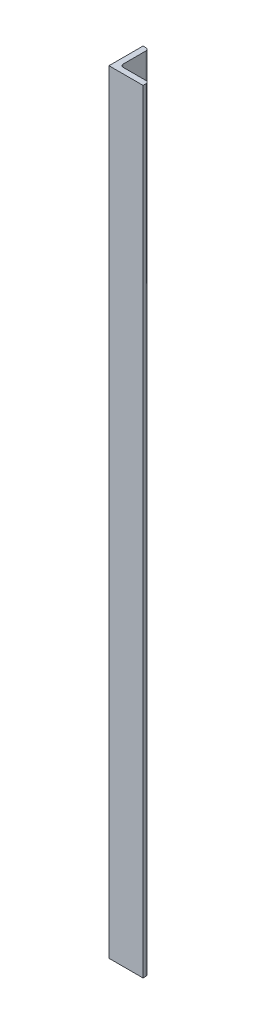
ISO-10303-21;
HEADER;
FILE_DESCRIPTION(('STEP AP214'),'2;1');
FILE_NAME('part.step','',(''),(''),'','','');
FILE_SCHEMA(('AUTOMOTIVE_DESIGN { 1 0 10303 214 1 1 1 1 }'));
ENDSEC;
DATA;
#1=APPLICATION_CONTEXT('core data for automotive mechanical design processes');
#2=APPLICATION_PROTOCOL_DEFINITION('international standard','automotive_design',2000,#1);
#3=PRODUCT_CONTEXT('',#1,'mechanical');
#4=PRODUCT('Part','Part','',(#3));
#5=PRODUCT_RELATED_PRODUCT_CATEGORY('part','',(#4));
#6=PRODUCT_DEFINITION_FORMATION('','',#4);
#7=PRODUCT_DEFINITION_CONTEXT('part definition',#1,'design');
#8=PRODUCT_DEFINITION('design','',#6,#7);
#9=PRODUCT_DEFINITION_SHAPE('','',#8);
#10=(LENGTH_UNIT() NAMED_UNIT(*) SI_UNIT(.MILLI.,.METRE.));
#11=(NAMED_UNIT(*) PLANE_ANGLE_UNIT() SI_UNIT($,.RADIAN.));
#12=(NAMED_UNIT(*) SI_UNIT($,.STERADIAN.) SOLID_ANGLE_UNIT());
#13=UNCERTAINTY_MEASURE_WITH_UNIT(LENGTH_MEASURE(1.E-05),#10,'distance_accuracy_value','');
#14=(GEOMETRIC_REPRESENTATION_CONTEXT(3) GLOBAL_UNCERTAINTY_ASSIGNED_CONTEXT((#13)) GLOBAL_UNIT_ASSIGNED_CONTEXT((#10,
#11,#12)) REPRESENTATION_CONTEXT('',''));
#15=CARTESIAN_POINT('',(0.,0.,0.));
#16=DIRECTION('',(0.,0.,1.));
#17=DIRECTION('',(1.,0.,0.));
#18=AXIS2_PLACEMENT_3D('',#15,#16,#17);
#19=CARTESIAN_POINT('',(0.,431.8,0.));
#20=DIRECTION('',(1.,0.,0.));
#21=DIRECTION('',(0.,0.,-1.));
#22=AXIS2_PLACEMENT_3D('',#19,#20,#21);
#23=PLANE('',#22);
#24=DIRECTION('',(0.,0.,1.));
#25=VECTOR('',#24,1.);
#26=CARTESIAN_POINT('',(0.,0.,0.));
#27=LINE('',#26,#25);
#28=CARTESIAN_POINT('',(0.,0.,-19.05));
#29=VERTEX_POINT('',#28);
#30=CARTESIAN_POINT('',(0.,0.,0.));
#31=VERTEX_POINT('',#30);
#32=EDGE_CURVE('E134',#29,#31,#27,.T.);
#33=ORIENTED_EDGE('',*,*,#32,.T.);
#34=DIRECTION('',(0.,-1.,0.));
#35=VECTOR('',#34,1.);
#36=CARTESIAN_POINT('',(0.,431.8,0.));
#37=LINE('',#36,#35);
#38=CARTESIAN_POINT('',(0.,431.8,0.));
#39=VERTEX_POINT('',#38);
#40=EDGE_CURVE('E11',#39,#31,#37,.T.);
#41=ORIENTED_EDGE('',*,*,#40,.F.);
#42=DIRECTION('',(0.,0.,1.));
#43=VECTOR('',#42,1.);
#44=CARTESIAN_POINT('',(0.,431.8,0.));
#45=LINE('',#44,#43);
#46=CARTESIAN_POINT('',(0.,431.8,-19.05));
#47=VERTEX_POINT('',#46);
#48=EDGE_CURVE('E150',#47,#39,#45,.T.);
#49=ORIENTED_EDGE('',*,*,#48,.F.);
#50=DIRECTION('',(0.,-1.,0.));
#51=VECTOR('',#50,1.);
#52=CARTESIAN_POINT('',(0.,431.8,-19.05));
#53=LINE('',#52,#51);
#54=EDGE_CURVE('E130',#47,#29,#53,.T.);
#55=ORIENTED_EDGE('',*,*,#54,.T.);
#56=EDGE_LOOP('',(#33,#41,#49,#55));
#57=FACE_BOUND('',#56,.T.);
#58=ADVANCED_FACE('F32',(#57),#23,.F.);
#59=CARTESIAN_POINT('',(0.,431.8,0.));
#60=DIRECTION('',(0.,0.,-1.));
#61=DIRECTION('',(-1.,0.,0.));
#62=AXIS2_PLACEMENT_3D('',#59,#60,#61);
#63=PLANE('',#62);
#64=DIRECTION('',(1.,0.,0.));
#65=VECTOR('',#64,1.);
#66=CARTESIAN_POINT('',(0.,0.,0.));
#67=LINE('',#66,#65);
#68=CARTESIAN_POINT('',(19.05,0.,0.));
#69=VERTEX_POINT('',#68);
#70=EDGE_CURVE('E137',#31,#69,#67,.T.);
#71=ORIENTED_EDGE('',*,*,#70,.T.);
#72=DIRECTION('',(0.,-1.,0.));
#73=VECTOR('',#72,1.);
#74=CARTESIAN_POINT('',(19.05,431.8,0.));
#75=LINE('',#74,#73);
#76=CARTESIAN_POINT('',(19.05,431.8,0.));
#77=VERTEX_POINT('',#76);
#78=EDGE_CURVE('E40',#77,#69,#75,.T.);
#79=ORIENTED_EDGE('',*,*,#78,.F.);
#80=DIRECTION('',(1.,0.,0.));
#81=VECTOR('',#80,1.);
#82=CARTESIAN_POINT('',(0.,431.8,0.));
#83=LINE('',#82,#81);
#84=EDGE_CURVE('E94',#39,#77,#83,.T.);
#85=ORIENTED_EDGE('',*,*,#84,.F.);
#86=ORIENTED_EDGE('',*,*,#40,.T.);
#87=EDGE_LOOP('',(#71,#79,#85,#86));
#88=FACE_BOUND('',#87,.T.);
#89=ADVANCED_FACE('F193',(#88),#63,.F.);
#90=CARTESIAN_POINT('',(19.05,431.8,-1.58749999999999));
#91=DIRECTION('',(-1.,0.,0.));
#92=DIRECTION('',(0.,0.,1.));
#93=AXIS2_PLACEMENT_3D('',#90,#91,#92);
#94=PLANE('',#93);
#95=DIRECTION('',(0.,0.,-1.));
#96=VECTOR('',#95,1.);
#97=CARTESIAN_POINT('',(19.05,0.,-1.58749999999999));
#98=LINE('',#97,#96);
#99=CARTESIAN_POINT('',(19.05,0.,-1.58749999999999));
#100=VERTEX_POINT('',#99);
#101=EDGE_CURVE('E139',#69,#100,#98,.T.);
#102=ORIENTED_EDGE('',*,*,#101,.T.);
#103=DIRECTION('',(0.,-1.,0.));
#104=VECTOR('',#103,1.);
#105=CARTESIAN_POINT('',(19.05,431.8,-1.58749999999999));
#106=LINE('',#105,#104);
#107=CARTESIAN_POINT('',(19.05,431.8,-1.58749999999999));
#108=VERTEX_POINT('',#107);
#109=EDGE_CURVE('E160',#108,#100,#106,.T.);
#110=ORIENTED_EDGE('',*,*,#109,.F.);
#111=DIRECTION('',(0.,0.,-1.));
#112=VECTOR('',#111,1.);
#113=CARTESIAN_POINT('',(19.05,431.8,-1.58749999999999));
#114=LINE('',#113,#112);
#115=EDGE_CURVE('E168',#77,#108,#114,.T.);
#116=ORIENTED_EDGE('',*,*,#115,.F.);
#117=ORIENTED_EDGE('',*,*,#78,.T.);
#118=EDGE_LOOP('',(#102,#110,#116,#117));
#119=FACE_BOUND('',#118,.T.);
#120=ADVANCED_FACE('F166',(#119),#94,.F.);
#121=CARTESIAN_POINT('',(17.4625,431.8,-1.5875));
#122=DIRECTION('',(0.,-1.,0.));
#123=DIRECTION('',(0.,0.,-1.));
#124=AXIS2_PLACEMENT_3D('',#121,#122,#123);
#125=CYLINDRICAL_SURFACE('',#124,1.5875);
#126=CARTESIAN_POINT('',(17.4625,0.,-1.5875));
#127=DIRECTION('',(0.,1.,0.));
#128=DIRECTION('',(0.,0.,-1.));
#129=AXIS2_PLACEMENT_3D('',#126,#127,#128);
#130=CIRCLE('',#129,1.5875);
#131=CARTESIAN_POINT('',(17.4625,0.,-3.175));
#132=VERTEX_POINT('',#131);
#133=EDGE_CURVE('E141',#100,#132,#130,.T.);
#134=ORIENTED_EDGE('',*,*,#133,.T.);
#135=DIRECTION('',(0.,-1.,0.));
#136=VECTOR('',#135,1.);
#137=CARTESIAN_POINT('',(17.4625,431.8,-3.175));
#138=LINE('',#137,#136);
#139=CARTESIAN_POINT('',(17.4625,431.8,-3.175));
#140=VERTEX_POINT('',#139);
#141=EDGE_CURVE('E157',#140,#132,#138,.T.);
#142=ORIENTED_EDGE('',*,*,#141,.F.);
#143=CARTESIAN_POINT('',(17.4625,431.8,-1.5875));
#144=DIRECTION('',(0.,1.,0.));
#145=DIRECTION('',(0.,0.,-1.));
#146=AXIS2_PLACEMENT_3D('',#143,#144,#145);
#147=CIRCLE('',#146,1.5875);
#148=EDGE_CURVE('E184',#108,#140,#147,.T.);
#149=ORIENTED_EDGE('',*,*,#148,.F.);
#150=ORIENTED_EDGE('',*,*,#109,.T.);
#151=EDGE_LOOP('',(#134,#142,#149,#150));
#152=FACE_BOUND('',#151,.T.);
#153=ADVANCED_FACE('F177',(#152),#125,.T.);
#154=CARTESIAN_POINT('',(4.76250000000001,431.8,-3.175));
#155=DIRECTION('',(0.,0.,1.));
#156=DIRECTION('',(1.,0.,0.));
#157=AXIS2_PLACEMENT_3D('',#154,#155,#156);
#158=PLANE('',#157);
#159=DIRECTION('',(-1.,0.,0.));
#160=VECTOR('',#159,1.);
#161=CARTESIAN_POINT('',(4.76250000000001,0.,-3.175));
#162=LINE('',#161,#160);
#163=CARTESIAN_POINT('',(4.76250000000001,0.,-3.175));
#164=VERTEX_POINT('',#163);
#165=EDGE_CURVE('E143',#132,#164,#162,.T.);
#166=ORIENTED_EDGE('',*,*,#165,.T.);
#167=DIRECTION('',(0.,-1.,0.));
#168=VECTOR('',#167,1.);
#169=CARTESIAN_POINT('',(4.76250000000001,431.8,-3.175));
#170=LINE('',#169,#168);
#171=CARTESIAN_POINT('',(4.76250000000001,431.8,-3.175));
#172=VERTEX_POINT('',#171);
#173=EDGE_CURVE('E154',#172,#164,#170,.T.);
#174=ORIENTED_EDGE('',*,*,#173,.F.);
#175=DIRECTION('',(-1.,0.,0.));
#176=VECTOR('',#175,1.);
#177=CARTESIAN_POINT('',(4.76250000000001,431.8,-3.175));
#178=LINE('',#177,#176);
#179=EDGE_CURVE('E183',#140,#172,#178,.T.);
#180=ORIENTED_EDGE('',*,*,#179,.F.);
#181=ORIENTED_EDGE('',*,*,#141,.T.);
#182=EDGE_LOOP('',(#166,#174,#180,#181));
#183=FACE_BOUND('',#182,.T.);
#184=ADVANCED_FACE('F181',(#183),#158,.F.);
#185=CARTESIAN_POINT('',(4.7625,431.8,-4.7625));
#186=DIRECTION('',(0.,-1.,0.));
#187=DIRECTION('',(0.,0.,-1.));
#188=AXIS2_PLACEMENT_3D('',#185,#186,#187);
#189=CYLINDRICAL_SURFACE('',#188,1.5875);
#190=CARTESIAN_POINT('',(4.7625,0.,-4.7625));
#191=DIRECTION('',(0.,-1.,0.));
#192=DIRECTION('',(0.,0.,1.));
#193=AXIS2_PLACEMENT_3D('',#190,#191,#192);
#194=CIRCLE('',#193,1.5875);
#195=CARTESIAN_POINT('',(3.175,0.,-4.76250000000001));
#196=VERTEX_POINT('',#195);
#197=EDGE_CURVE('E145',#164,#196,#194,.T.);
#198=ORIENTED_EDGE('',*,*,#197,.T.);
#199=DIRECTION('',(0.,-1.,0.));
#200=VECTOR('',#199,1.);
#201=CARTESIAN_POINT('',(3.175,431.8,-4.76250000000001));
#202=LINE('',#201,#200);
#203=CARTESIAN_POINT('',(3.175,431.8,-4.76250000000001));
#204=VERTEX_POINT('',#203);
#205=EDGE_CURVE('E125',#204,#196,#202,.T.);
#206=ORIENTED_EDGE('',*,*,#205,.F.);
#207=CARTESIAN_POINT('',(4.7625,431.8,-4.7625));
#208=DIRECTION('',(0.,-1.,0.));
#209=DIRECTION('',(0.,0.,1.));
#210=AXIS2_PLACEMENT_3D('',#207,#208,#209);
#211=CIRCLE('',#210,1.5875);
#212=EDGE_CURVE('E116',#172,#204,#211,.T.);
#213=ORIENTED_EDGE('',*,*,#212,.F.);
#214=ORIENTED_EDGE('',*,*,#173,.T.);
#215=EDGE_LOOP('',(#198,#206,#213,#214));
#216=FACE_BOUND('',#215,.T.);
#217=ADVANCED_FACE('F205',(#216),#189,.F.);
#218=CARTESIAN_POINT('',(3.175,431.8,-4.76250000000001));
#219=DIRECTION('',(-1.,0.,0.));
#220=DIRECTION('',(0.,0.,1.));
#221=AXIS2_PLACEMENT_3D('',#218,#219,#220);
#222=PLANE('',#221);
#223=DIRECTION('',(0.,0.,-1.));
#224=VECTOR('',#223,1.);
#225=CARTESIAN_POINT('',(3.175,0.,-4.76250000000001));
#226=LINE('',#225,#224);
#227=CARTESIAN_POINT('',(3.175,0.,-17.4625));
#228=VERTEX_POINT('',#227);
#229=EDGE_CURVE('E124',#196,#228,#226,.T.);
#230=ORIENTED_EDGE('',*,*,#229,.T.);
#231=DIRECTION('',(0.,-1.,0.));
#232=VECTOR('',#231,1.);
#233=CARTESIAN_POINT('',(3.175,431.8,-17.4625));
#234=LINE('',#233,#232);
#235=CARTESIAN_POINT('',(3.175,431.8,-17.4625));
#236=VERTEX_POINT('',#235);
#237=EDGE_CURVE('E121',#236,#228,#234,.T.);
#238=ORIENTED_EDGE('',*,*,#237,.F.);
#239=DIRECTION('',(0.,0.,-1.));
#240=VECTOR('',#239,1.);
#241=CARTESIAN_POINT('',(3.175,431.8,-4.76250000000001));
#242=LINE('',#241,#240);
#243=EDGE_CURVE('E110',#204,#236,#242,.T.);
#244=ORIENTED_EDGE('',*,*,#243,.F.);
#245=ORIENTED_EDGE('',*,*,#205,.T.);
#246=EDGE_LOOP('',(#230,#238,#244,#245));
#247=FACE_BOUND('',#246,.T.);
#248=ADVANCED_FACE('F122',(#247),#222,.F.);
#249=CARTESIAN_POINT('',(1.5875,431.8,-17.4625));
#250=DIRECTION('',(0.,-1.,0.));
#251=DIRECTION('',(0.,0.,-1.));
#252=AXIS2_PLACEMENT_3D('',#249,#250,#251);
#253=CYLINDRICAL_SURFACE('',#252,1.5875);
#254=CARTESIAN_POINT('',(1.5875,0.,-17.4625));
#255=DIRECTION('',(0.,1.,0.));
#256=DIRECTION('',(0.,0.,1.));
#257=AXIS2_PLACEMENT_3D('',#254,#255,#256);
#258=CIRCLE('',#257,1.5875);
#259=CARTESIAN_POINT('',(1.58749999999999,0.,-19.05));
#260=VERTEX_POINT('',#259);
#261=EDGE_CURVE('E80',#228,#260,#258,.T.);
#262=ORIENTED_EDGE('',*,*,#261,.T.);
#263=DIRECTION('',(0.,-1.,0.));
#264=VECTOR('',#263,1.);
#265=CARTESIAN_POINT('',(1.58749999999999,431.8,-19.05));
#266=LINE('',#265,#264);
#267=CARTESIAN_POINT('',(1.58749999999999,431.8,-19.05));
#268=VERTEX_POINT('',#267);
#269=EDGE_CURVE('E126',#268,#260,#266,.T.);
#270=ORIENTED_EDGE('',*,*,#269,.F.);
#271=CARTESIAN_POINT('',(1.5875,431.8,-17.4625));
#272=DIRECTION('',(0.,1.,0.));
#273=DIRECTION('',(0.,0.,1.));
#274=AXIS2_PLACEMENT_3D('',#271,#272,#273);
#275=CIRCLE('',#274,1.5875);
#276=EDGE_CURVE('E114',#236,#268,#275,.T.);
#277=ORIENTED_EDGE('',*,*,#276,.F.);
#278=ORIENTED_EDGE('',*,*,#237,.T.);
#279=EDGE_LOOP('',(#262,#270,#277,#278));
#280=FACE_BOUND('',#279,.T.);
#281=ADVANCED_FACE('F128',(#280),#253,.T.);
#282=CARTESIAN_POINT('',(0.,431.8,-19.05));
#283=DIRECTION('',(0.,0.,1.));
#284=DIRECTION('',(1.,0.,0.));
#285=AXIS2_PLACEMENT_3D('',#282,#283,#284);
#286=PLANE('',#285);
#287=DIRECTION('',(-1.,0.,0.));
#288=VECTOR('',#287,1.);
#289=CARTESIAN_POINT('',(0.,0.,-19.05));
#290=LINE('',#289,#288);
#291=EDGE_CURVE('E86',#260,#29,#290,.T.);
#292=ORIENTED_EDGE('',*,*,#291,.T.);
#293=ORIENTED_EDGE('',*,*,#54,.F.);
#294=DIRECTION('',(-1.,0.,0.));
#295=VECTOR('',#294,1.);
#296=CARTESIAN_POINT('',(0.,431.8,-19.05));
#297=LINE('',#296,#295);
#298=EDGE_CURVE('E48',#268,#47,#297,.T.);
#299=ORIENTED_EDGE('',*,*,#298,.F.);
#300=ORIENTED_EDGE('',*,*,#269,.T.);
#301=EDGE_LOOP('',(#292,#293,#299,#300));
#302=FACE_BOUND('',#301,.T.);
#303=ADVANCED_FACE('F213',(#302),#286,.F.);
#304=CARTESIAN_POINT('',(1.5875,431.8,-17.4625));
#305=DIRECTION('',(0.,1.,0.));
#306=DIRECTION('',(0.,0.,1.));
#307=AXIS2_PLACEMENT_3D('',#304,#305,#306);
#308=PLANE('',#307);
#309=ORIENTED_EDGE('',*,*,#48,.T.);
#310=ORIENTED_EDGE('',*,*,#84,.T.);
#311=ORIENTED_EDGE('',*,*,#115,.T.);
#312=ORIENTED_EDGE('',*,*,#148,.T.);
#313=ORIENTED_EDGE('',*,*,#179,.T.);
#314=ORIENTED_EDGE('',*,*,#212,.T.);
#315=ORIENTED_EDGE('',*,*,#243,.T.);
#316=ORIENTED_EDGE('',*,*,#276,.T.);
#317=ORIENTED_EDGE('',*,*,#298,.T.);
#318=EDGE_LOOP('',(#309,#310,#311,#312,#313,#314,#315,#316,#317));
#319=FACE_BOUND('',#318,.T.);
#320=ADVANCED_FACE('F112',(#319),#308,.T.);
#321=CARTESIAN_POINT('',(1.5875,0.,-17.4625));
#322=DIRECTION('',(0.,1.,0.));
#323=DIRECTION('',(0.,0.,1.));
#324=AXIS2_PLACEMENT_3D('',#321,#322,#323);
#325=PLANE('',#324);
#326=ORIENTED_EDGE('',*,*,#32,.F.);
#327=ORIENTED_EDGE('',*,*,#291,.F.);
#328=ORIENTED_EDGE('',*,*,#261,.F.);
#329=ORIENTED_EDGE('',*,*,#229,.F.);
#330=ORIENTED_EDGE('',*,*,#197,.F.);
#331=ORIENTED_EDGE('',*,*,#165,.F.);
#332=ORIENTED_EDGE('',*,*,#133,.F.);
#333=ORIENTED_EDGE('',*,*,#101,.F.);
#334=ORIENTED_EDGE('',*,*,#70,.F.);
#335=EDGE_LOOP('',(#326,#327,#328,#329,#330,#331,#332,#333,#334));
#336=FACE_BOUND('',#335,.T.);
#337=ADVANCED_FACE('F172',(#336),#325,.F.);
#338=CLOSED_SHELL('',(#58,#89,#120,#153,#184,#217,#248,#281,#303,#320,#337));
#339=MANIFOLD_SOLID_BREP('B2',#338);
#340=ADVANCED_BREP_SHAPE_REPRESENTATION('',(#18,#339),#14);
#341=SHAPE_DEFINITION_REPRESENTATION(#9,#340);
ENDSEC;
END-ISO-10303-21;
